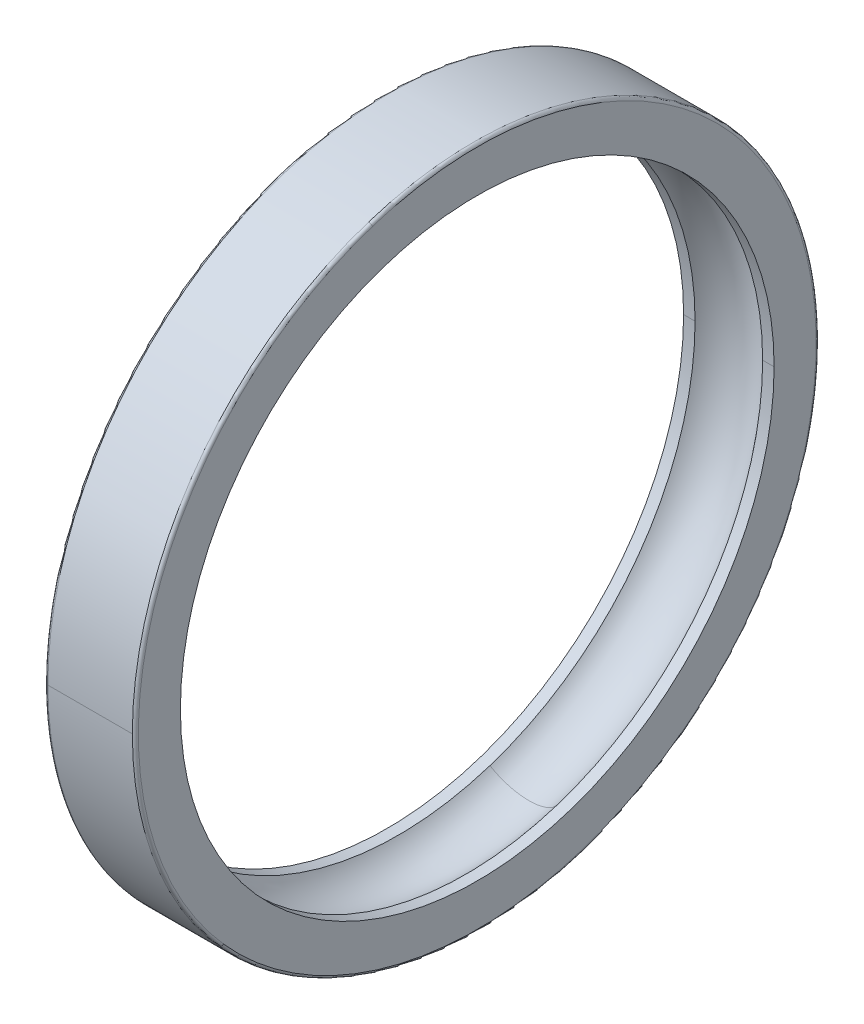
ISO-10303-21;
HEADER;
FILE_DESCRIPTION(('STEP AP214'),'2;1');
FILE_NAME('part.step','',(''),(''),'','','');
FILE_SCHEMA(('AUTOMOTIVE_DESIGN { 1 0 10303 214 1 1 1 1 }'));
ENDSEC;
DATA;
#1=APPLICATION_CONTEXT('core data for automotive mechanical design processes');
#2=APPLICATION_PROTOCOL_DEFINITION('international standard','automotive_design',2000,#1);
#3=PRODUCT_CONTEXT('',#1,'mechanical');
#4=PRODUCT('Part','Part','',(#3));
#5=PRODUCT_RELATED_PRODUCT_CATEGORY('part','',(#4));
#6=PRODUCT_DEFINITION_FORMATION('','',#4);
#7=PRODUCT_DEFINITION_CONTEXT('part definition',#1,'design');
#8=PRODUCT_DEFINITION('design','',#6,#7);
#9=PRODUCT_DEFINITION_SHAPE('','',#8);
#10=(LENGTH_UNIT() NAMED_UNIT(*) SI_UNIT(.MILLI.,.METRE.));
#11=(NAMED_UNIT(*) PLANE_ANGLE_UNIT() SI_UNIT($,.RADIAN.));
#12=(NAMED_UNIT(*) SI_UNIT($,.STERADIAN.) SOLID_ANGLE_UNIT());
#13=UNCERTAINTY_MEASURE_WITH_UNIT(LENGTH_MEASURE(1.E-05),#10,'distance_accuracy_value','');
#14=(GEOMETRIC_REPRESENTATION_CONTEXT(3) GLOBAL_UNCERTAINTY_ASSIGNED_CONTEXT((#13)) GLOBAL_UNIT_ASSIGNED_CONTEXT((#10,
#11,#12)) REPRESENTATION_CONTEXT('',''));
#15=CARTESIAN_POINT('',(0.,0.,0.));
#16=DIRECTION('',(0.,0.,1.));
#17=DIRECTION('',(1.,0.,0.));
#18=AXIS2_PLACEMENT_3D('',#15,#16,#17);
#19=CARTESIAN_POINT('',(0.,33.7,0.));
#20=DIRECTION('',(-1.,0.,0.));
#21=DIRECTION('',(0.,0.,1.));
#22=AXIS2_PLACEMENT_3D('',#19,#20,#21);
#23=PLANE('',#22);
#24=CARTESIAN_POINT('',(0.,0.,0.));
#25=DIRECTION('',(1.,0.,0.));
#26=DIRECTION('',(0.,0.,-1.));
#27=AXIS2_PLACEMENT_3D('',#24,#25,#26);
#28=CIRCLE('',#27,29.52);
#29=CARTESIAN_POINT('',(0.,0.,-29.52));
#30=VERTEX_POINT('',#29);
#31=CARTESIAN_POINT('',(0.,0.,29.52));
#32=VERTEX_POINT('',#31);
#33=EDGE_CURVE('E11',#30,#32,#28,.T.);
#34=ORIENTED_EDGE('',*,*,#33,.T.);
#35=CARTESIAN_POINT('',(0.,0.,0.));
#36=DIRECTION('',(1.,0.,0.));
#37=DIRECTION('',(0.,0.,-1.));
#38=AXIS2_PLACEMENT_3D('',#35,#36,#37);
#39=CIRCLE('',#38,29.52);
#40=EDGE_CURVE('E26',#32,#30,#39,.T.);
#41=ORIENTED_EDGE('',*,*,#40,.T.);
#42=EDGE_LOOP('',(#34,#41));
#43=FACE_BOUND('',#42,.T.);
#44=CARTESIAN_POINT('',(0.,32.0506045991467,10.4138727104358));
#45=CARTESIAN_POINT('',(0.,31.8802189577156,10.9383036459761));
#46=CARTESIAN_POINT('',(0.,31.6969404011006,11.4585443729204));
#47=CARTESIAN_POINT('',(0.,31.3050870541263,12.4894103733798));
#48=CARTESIAN_POINT('',(0.,31.096512263767,13.0000356468947));
#49=CARTESIAN_POINT('',(0.,30.6545560459279,14.0104357042572));
#50=CARTESIAN_POINT('',(0.,30.4211746184479,14.5102104881048));
#51=CARTESIAN_POINT('',(0.,29.9301708134022,15.4977068765759));
#52=CARTESIAN_POINT('',(0.,29.6725484358364,15.9854284811993));
#53=CARTESIAN_POINT('',(0.,29.1336824408701,16.9476431956956));
#54=CARTESIAN_POINT('',(0.,28.8524388234696,17.4221363055684));
#55=CARTESIAN_POINT('',(0.,28.2670081370938,18.3567510292747));
#56=CARTESIAN_POINT('',(0.,27.9628210681185,18.8168726431083));
#57=CARTESIAN_POINT('',(0.,27.3322362255011,19.7216358762329));
#58=CARTESIAN_POINT('',(0.,27.005838451859,20.1662774955239));
#59=CARTESIAN_POINT('',(0.,26.3316185385215,21.0390095657177));
#60=CARTESIAN_POINT('',(0.,25.9837963988261,21.4671000166206));
#61=CARTESIAN_POINT('',(0.,25.2675656826159,22.3056984408339));
#62=CARTESIAN_POINT('',(0.,24.8991571061012,22.7162064141445));
#63=CARTESIAN_POINT('',(0.,24.1426410460591,23.5186509339946));
#64=CARTESIAN_POINT('',(0.,23.7545335625317,23.9105874805343));
#65=CARTESIAN_POINT('',(0.,22.9595546730441,24.6749449372425));
#66=CARTESIAN_POINT('',(0.,22.5526832670839,25.0473658474111));
#67=CARTESIAN_POINT('',(0.,21.721156721677,25.7717948368191));
#68=CARTESIAN_POINT('',(0.,21.2965015822303,26.1238029160585));
#69=CARTESIAN_POINT('',(0.,20.4304306012523,26.8065582253038));
#70=CARTESIAN_POINT('',(0.,19.989014759721,27.1373054553097));
#71=CARTESIAN_POINT('',(0.,19.0904857840059,27.7767422670432));
#72=CARTESIAN_POINT('',(0.,18.6333726498222,28.0854318487709));
#73=CARTESIAN_POINT('',(0.,17.7045503143791,28.6800097037069));
#74=CARTESIAN_POINT('',(0.,17.2328411131199,28.9658979769153));
#75=CARTESIAN_POINT('',(0.,16.2759630323089,29.514184484922));
#76=CARTESIAN_POINT('',(0.,15.7907941527573,29.7765827197203));
#77=CARTESIAN_POINT('',(0.,14.8081655296881,30.2772570105757));
#78=CARTESIAN_POINT('',(0.,14.3107057861705,30.5155330666329));
#79=CARTESIAN_POINT('',(0.,13.304693859264,30.9673889721165));
#80=CARTESIAN_POINT('',(0.,12.7961416758751,31.1809688215429));
#81=CARTESIAN_POINT('',(0.,11.7691700159795,31.5829177812005));
#82=CARTESIAN_POINT('',(0.,11.2507505394728,31.7712868914316));
#83=CARTESIAN_POINT('',(0.,10.2052932112689,32.1223605750127));
#84=CARTESIAN_POINT('',(0.,9.67825535957162,32.2850651483627));
#85=CARTESIAN_POINT('',(0.,8.61683096133426,32.5844177886132));
#86=CARTESIAN_POINT('',(0.,8.08244441479417,32.7210658555137));
#87=CARTESIAN_POINT('',(0.,7.00761001086851,32.967976285703));
#88=CARTESIAN_POINT('',(0.,6.46716215348294,33.0782386489918));
#89=CARTESIAN_POINT('',(0.,5.38150711409243,33.2721120402669));
#90=CARTESIAN_POINT('',(0.,4.83629993208748,33.3557230682531));
#91=CARTESIAN_POINT('',(0.,3.74243969531415,33.4960923626329));
#92=CARTESIAN_POINT('',(0.,3.19378664054578,33.5528506290266));
#93=CARTESIAN_POINT('',(0.,2.09435641151086,33.6393776645862));
#94=CARTESIAN_POINT('',(0.,1.54357923724432,33.6691464337522));
#95=CARTESIAN_POINT('',(0.,0.441227639668275,33.701622759284));
#96=CARTESIAN_POINT('',(0.,-0.110346783641229,33.7043303156499));
#97=CARTESIAN_POINT('',(0.,-1.21296408820524,33.6826776928412));
#98=CARTESIAN_POINT('',(0.,-1.76400696945974,33.6583175136666));
#99=CARTESIAN_POINT('',(0.,-2.86423367934716,33.5825881055822));
#100=CARTESIAN_POINT('',(0.,-3.41341750798007,33.5312188766725));
#101=CARTESIAN_POINT('',(0.,-4.5086030806783,33.4015951220896));
#102=CARTESIAN_POINT('',(0.,-5.05460482474361,33.3233405964165));
#103=CARTESIAN_POINT('',(0.,-6.14211086228109,33.1401347703136));
#104=CARTESIAN_POINT('',(0.,-6.68361515575326,33.0351834698838));
#105=CARTESIAN_POINT('',(0.,-7.76082176083128,32.798836931143));
#106=CARTESIAN_POINT('',(0.,-8.29652407243714,32.6674416928319));
#107=CARTESIAN_POINT('',(0.,-9.36083615999192,32.3785238209664));
#108=CARTESIAN_POINT('',(0.,-9.88944593594084,32.221001187412));
#109=CARTESIAN_POINT('',(0.,-10.9382994849307,31.8802080108814));
#110=CARTESIAN_POINT('',(0.,-11.4585432579717,31.6969374679052));
#111=CARTESIAN_POINT('',(0.,-12.4894114883285,31.3050899873217));
#112=CARTESIAN_POINT('',(0.,-13.0000359456442,31.0965130497144));
#113=CARTESIAN_POINT('',(0.,-14.0104354055075,30.6545552599805));
#114=CARTESIAN_POINT('',(0.,-14.5102104080551,30.421174407854));
#115=CARTESIAN_POINT('',(0.,-15.4977069566256,29.9301710239962));
#116=CARTESIAN_POINT('',(0.,-15.9854285026486,29.6725484922649));
#117=CARTESIAN_POINT('',(0.,-16.9476431742463,29.1336823844416));
#118=CARTESIAN_POINT('',(0.,-17.422136299821,28.8524388083496));
#119=CARTESIAN_POINT('',(0.,-18.356751035022,28.2670081522137));
#120=CARTESIAN_POINT('',(0.,-18.8168726446483,27.9628210721699));
#121=CARTESIAN_POINT('',(0.,-19.7216358746929,27.3322362214497));
#122=CARTESIAN_POINT('',(0.,-20.1662774951112,27.0058384507734));
#123=CARTESIAN_POINT('',(0.,-21.0390095661303,26.331618539607));
#124=CARTESIAN_POINT('',(0.,-21.4671000167311,25.983796399117));
#125=CARTESIAN_POINT('',(0.,-22.3056984407234,25.2675656823251));
#126=CARTESIAN_POINT('',(0.,-22.7162064141148,24.8991571060233));
#127=CARTESIAN_POINT('',(0.,-23.5186509340242,24.142641046137));
#128=CARTESIAN_POINT('',(0.,-23.9105874805422,23.7545335625526));
#129=CARTESIAN_POINT('',(0.,-24.6749449372346,22.9595546730232));
#130=CARTESIAN_POINT('',(0.,-25.0473658474089,22.5526832670783));
#131=CARTESIAN_POINT('',(0.,-25.7717948368212,21.7211567216826));
#132=CARTESIAN_POINT('',(0.,-26.123802916059,21.2965015822319));
#133=CARTESIAN_POINT('',(0.,-26.8065582253032,20.4304306012509));
#134=CARTESIAN_POINT('',(0.,-27.1373054553095,19.9890147597206));
#135=CARTESIAN_POINT('',(0.,-27.7767422670433,19.0904857840063));
#136=CARTESIAN_POINT('',(0.,-28.0854318487709,18.6333726498223));
#137=CARTESIAN_POINT('',(0.,-28.6800097037069,17.7045503143791));
#138=CARTESIAN_POINT('',(0.,-28.9658979769153,17.2328411131199));
#139=CARTESIAN_POINT('',(0.,-29.514184484922,16.275963032309));
#140=CARTESIAN_POINT('',(0.,-29.7765827197203,15.7907941527573));
#141=CARTESIAN_POINT('',(0.,-30.2772570105757,14.8081655296881));
#142=CARTESIAN_POINT('',(0.,-30.5155330666328,14.3107057861705));
#143=CARTESIAN_POINT('',(0.,-30.9673889721165,13.304693859264));
#144=CARTESIAN_POINT('',(0.,-31.180968821543,12.7961416758751));
#145=CARTESIAN_POINT('',(0.,-31.5829177812004,11.7691700159795));
#146=CARTESIAN_POINT('',(0.,-31.7712868914311,11.250750539473));
#147=CARTESIAN_POINT('',(0.,-32.1223605750131,10.2052932112688));
#148=CARTESIAN_POINT('',(0.,-32.2850651483642,9.67825535957124));
#149=CARTESIAN_POINT('',(0.,-32.5844177886116,8.61683096133471));
#150=CARTESIAN_POINT('',(0.,-32.7210658555079,8.08244441479577));
#151=CARTESIAN_POINT('',(0.,-32.9679762857088,7.00761001086698));
#152=CARTESIAN_POINT('',(0.,-33.0782386490134,6.46716215347713));
#153=CARTESIAN_POINT('',(0.,-33.2721120402453,5.38150711409832));
#154=CARTESIAN_POINT('',(0.,-33.3557230681726,4.83629993210935));
#155=CARTESIAN_POINT('',(0.,-33.4960923627134,3.74243969529233));
#156=CARTESIAN_POINT('',(0.,-33.5528506293269,3.19378664046427));
#157=CARTESIAN_POINT('',(0.,-33.6393776642859,2.0943564115924));
#158=CARTESIAN_POINT('',(0.,-33.6691464326314,1.54357923754859));
#159=CARTESIAN_POINT('',(0.,-33.7016227604048,0.44122763936406));
#160=CARTESIAN_POINT('',(0.,-33.7043303198328,-0.110346784776663));
#161=CARTESIAN_POINT('',(0.,-33.6826776886584,-1.21296408706974));
#162=CARTESIAN_POINT('',(0.,-33.6583174980561,-1.76400696522209));
#163=CARTESIAN_POINT('',(0.,-33.5825881211927,-2.86423368358475));
#164=CARTESIAN_POINT('',(0.,-33.5312189349316,-3.41341752379507));
#165=CARTESIAN_POINT('',(0.,-33.4015950638304,-4.50860306486327));
#166=CARTESIAN_POINT('',(0.,-33.3233403789904,-5.05460476572116));
#167=CARTESIAN_POINT('',(0.,-33.1401349877397,-6.14211092130351));
#168=CARTESIAN_POINT('',(0.,-33.0351842813292,-6.68361537602797));
#169=CARTESIAN_POINT('',(0.,-32.7988361196976,-7.76082154055651));
#170=CARTESIAN_POINT('',(0.,-32.6674386644765,-8.29652325036059));
#171=CARTESIAN_POINT('',(0.,-32.3785268493217,-9.36083698206841));
#172=CARTESIAN_POINT('',(0.,-32.2210124893879,-9.88944900397215));
#173=CARTESIAN_POINT('',(0.,-32.0506045991467,-10.4138727104357));
#174=B_SPLINE_CURVE_WITH_KNOTS('',3,(#44,#45,#46,#47,#48,#49,#50,#51,#52,#53,#54,#55,#56,#57,
#58,#59,#60,#61,#62,#63,#64,#65,#66,#67,#68,#69,#70,#71,#72,#73,#74,#75,#76,#77,#78,#79,#80,#81,
#82,#83,#84,#85,#86,#87,#88,#89,#90,#91,#92,#93,#94,#95,#96,#97,#98,#99,#100,#101,#102,#103,
#104,#105,#106,#107,#108,#109,#110,#111,#112,#113,#114,#115,#116,#117,#118,#119,#120,#121,#122,
#123,#124,#125,#126,#127,#128,#129,#130,#131,#132,#133,#134,#135,#136,#137,#138,#139,#140,#141,
#142,#143,#144,#145,#146,#147,#148,#149,#150,#151,#152,#153,#154,#155,#156,#157,#158,#159,#160,
#161,#162,#163,#164,#165,#166,#167,#168,#169,#170,#171,#172,#173),.UNSPECIFIED.,.F.,.F.,(4,2,2,
2,2,2,2,2,2,2,2,2,2,2,2,2,2,2,2,2,2,2,2,2,2,2,2,2,2,2,2,2,2,2,2,2,2,2,2,2,2,2,2,2,2,2,2,2,2,2,2,
2,2,2,2,2,2,2,2,2,2,2,2,2,4),(0.,1.65407880244428,3.30815760488857,4.96223640733286,
6.61631520977715,8.27039401222144,9.92447281466573,11.57855161711,13.2326304195543,
14.8867092219986,16.5407880244429,18.1948668268872,19.8489456293314,21.5030244317757,
23.15710323422,24.8111820366643,26.4652608391086,28.1193396415529,29.7734184439972,
31.4274972464415,33.0815760488857,34.73565485133,36.3897336537743,38.0438124562186,
39.6978912586629,41.3519700611072,43.0060488635515,44.6601276659957,46.31420646844,
47.9682852708843,49.6223640733286,51.2764428757729,52.9305216782172,54.5846004806615,
56.2386792831057,57.89275808555,59.5468368879943,61.2009156904386,62.8549944928829,
64.5090732953272,66.1631520977715,67.8172309002157,69.47130970266,71.1253885051043,
72.7794673075486,74.4335461099929,76.0876249124372,77.7417037148815,79.3957825173257,
81.04986131977,82.7039401222143,84.3580189246586,86.0120977271029,87.6661765295472,
89.3202553319914,90.9743341344358,92.62841293688,94.2824917393243,95.9365705417686,
97.5906493442129,99.2447281466572,100.898806949101,102.552885751546,104.20696455399,
105.861043356434),.UNSPECIFIED.);
#175=CARTESIAN_POINT('',(0.,32.0506045991467,10.4138727104357));
#176=VERTEX_POINT('',#175);
#177=CARTESIAN_POINT('',(0.,-32.0506045991467,-10.4138727104357));
#178=VERTEX_POINT('',#177);
#179=EDGE_CURVE('E242',#176,#178,#174,.T.);
#180=ORIENTED_EDGE('',*,*,#179,.F.);
#181=CARTESIAN_POINT('',(0.,-32.0506045991467,-10.4138727104358));
#182=CARTESIAN_POINT('',(0.,-31.8802189577156,-10.9383036459761));
#183=CARTESIAN_POINT('',(0.,-31.6969404011006,-11.4585443729204));
#184=CARTESIAN_POINT('',(0.,-31.3050870541263,-12.4894103733797));
#185=CARTESIAN_POINT('',(0.,-31.096512263767,-13.0000356468947));
#186=CARTESIAN_POINT('',(0.,-30.6545560459279,-14.0104357042572));
#187=CARTESIAN_POINT('',(0.,-30.4211746184479,-14.5102104881048));
#188=CARTESIAN_POINT('',(0.,-29.9301708134022,-15.4977068765759));
#189=CARTESIAN_POINT('',(0.,-29.6725484358364,-15.9854284811993));
#190=CARTESIAN_POINT('',(0.,-29.1336824408701,-16.9476431956956));
#191=CARTESIAN_POINT('',(0.,-28.8524388234696,-17.4221363055683));
#192=CARTESIAN_POINT('',(0.,-28.2670081370938,-18.3567510292747));
#193=CARTESIAN_POINT('',(0.,-27.9628210681185,-18.8168726431083));
#194=CARTESIAN_POINT('',(0.,-27.3322362255011,-19.7216358762329));
#195=CARTESIAN_POINT('',(0.,-27.005838451859,-20.1662774955238));
#196=CARTESIAN_POINT('',(0.,-26.3316185385215,-21.0390095657177));
#197=CARTESIAN_POINT('',(0.,-25.9837963988261,-21.4671000166205));
#198=CARTESIAN_POINT('',(0.,-25.2675656826159,-22.3056984408339));
#199=CARTESIAN_POINT('',(0.,-24.8991571061012,-22.7162064141445));
#200=CARTESIAN_POINT('',(0.,-24.1426410460591,-23.5186509339946));
#201=CARTESIAN_POINT('',(0.,-23.7545335625317,-23.9105874805343));
#202=CARTESIAN_POINT('',(0.,-22.9595546730441,-24.6749449372425));
#203=CARTESIAN_POINT('',(0.,-22.5526832670839,-25.047365847411));
#204=CARTESIAN_POINT('',(0.,-21.721156721677,-25.771794836819));
#205=CARTESIAN_POINT('',(0.,-21.2965015822304,-26.1238029160585));
#206=CARTESIAN_POINT('',(0.,-20.4304306012524,-26.8065582253038));
#207=CARTESIAN_POINT('',(0.,-19.989014759721,-27.1373054553097));
#208=CARTESIAN_POINT('',(0.,-19.0904857840059,-27.7767422670432));
#209=CARTESIAN_POINT('',(0.,-18.6333726498222,-28.0854318487708));
#210=CARTESIAN_POINT('',(0.,-17.7045503143792,-28.6800097037069));
#211=CARTESIAN_POINT('',(0.,-17.2328411131199,-28.9658979769153));
#212=CARTESIAN_POINT('',(0.,-16.2759630323089,-29.514184484922));
#213=CARTESIAN_POINT('',(0.,-15.7907941527573,-29.7765827197203));
#214=CARTESIAN_POINT('',(0.,-14.8081655296881,-30.2772570105757));
#215=CARTESIAN_POINT('',(0.,-14.3107057861705,-30.5155330666329));
#216=CARTESIAN_POINT('',(0.,-13.3046938592641,-30.9673889721165));
#217=CARTESIAN_POINT('',(0.,-12.7961416758751,-31.1809688215429));
#218=CARTESIAN_POINT('',(0.,-11.7691700159795,-31.5829177812005));
#219=CARTESIAN_POINT('',(0.,-11.2507505394729,-31.7712868914316));
#220=CARTESIAN_POINT('',(0.,-10.2052932112689,-32.1223605750127));
#221=CARTESIAN_POINT('',(0.,-9.67825535957166,-32.2850651483627));
#222=CARTESIAN_POINT('',(0.,-8.61683096133429,-32.5844177886132));
#223=CARTESIAN_POINT('',(0.,-8.0824444147942,-32.7210658555137));
#224=CARTESIAN_POINT('',(0.,-7.00761001086855,-32.967976285703));
#225=CARTESIAN_POINT('',(0.,-6.46716215348299,-33.0782386489918));
#226=CARTESIAN_POINT('',(0.,-5.38150711409247,-33.2721120402669));
#227=CARTESIAN_POINT('',(0.,-4.83629993208753,-33.3557230682531));
#228=CARTESIAN_POINT('',(0.,-3.7424396953142,-33.4960923626329));
#229=CARTESIAN_POINT('',(0.,-3.19378664054582,-33.5528506290266));
#230=CARTESIAN_POINT('',(0.,-2.0943564115109,-33.6393776645862));
#231=CARTESIAN_POINT('',(0.,-1.54357923724436,-33.6691464337522));
#232=CARTESIAN_POINT('',(0.,-0.441227639668314,-33.701622759284));
#233=CARTESIAN_POINT('',(0.,0.110346783641185,-33.7043303156499));
#234=CARTESIAN_POINT('',(0.,1.21296408820519,-33.6826776928412));
#235=CARTESIAN_POINT('',(0.,1.76400696945969,-33.6583175136666));
#236=CARTESIAN_POINT('',(0.,2.86423367934711,-33.5825881055822));
#237=CARTESIAN_POINT('',(0.,3.41341750798001,-33.5312188766725));
#238=CARTESIAN_POINT('',(0.,4.50860308067824,-33.4015951220896));
#239=CARTESIAN_POINT('',(0.,5.05460482474355,-33.3233405964165));
#240=CARTESIAN_POINT('',(0.,6.14211086228103,-33.1401347703136));
#241=CARTESIAN_POINT('',(0.,6.6836151557532,-33.0351834698838));
#242=CARTESIAN_POINT('',(0.,7.76082176083122,-32.798836931143));
#243=CARTESIAN_POINT('',(0.,8.29652407243708,-32.6674416928319));
#244=CARTESIAN_POINT('',(0.,9.36083615999186,-32.3785238209664));
#245=CARTESIAN_POINT('',(0.,9.88944593594078,-32.221001187412));
#246=CARTESIAN_POINT('',(0.,10.9382994849307,-31.8802080108814));
#247=CARTESIAN_POINT('',(0.,11.4585432579716,-31.6969374679052));
#248=CARTESIAN_POINT('',(0.,12.4894114883284,-31.3050899873217));
#249=CARTESIAN_POINT('',(0.,13.0000359456442,-31.0965130497144));
#250=CARTESIAN_POINT('',(0.,14.0104354055075,-30.6545552599806));
#251=CARTESIAN_POINT('',(0.,14.510210408055,-30.421174407854));
#252=CARTESIAN_POINT('',(0.,15.4977069566255,-29.9301710239962));
#253=CARTESIAN_POINT('',(0.,15.9854285026485,-29.6725484922649));
#254=CARTESIAN_POINT('',(0.,16.9476431742462,-29.1336823844416));
#255=CARTESIAN_POINT('',(0.,17.4221362998209,-28.8524388083497));
#256=CARTESIAN_POINT('',(0.,18.3567510350219,-28.2670081522138));
#257=CARTESIAN_POINT('',(0.,18.8168726446482,-27.9628210721699));
#258=CARTESIAN_POINT('',(0.,19.7216358746928,-27.3322362214497));
#259=CARTESIAN_POINT('',(0.,20.1662774951111,-27.0058384507735));
#260=CARTESIAN_POINT('',(0.,21.0390095661303,-26.3316185396071));
#261=CARTESIAN_POINT('',(0.,21.467100016731,-25.983796399117));
#262=CARTESIAN_POINT('',(0.,22.3056984407233,-25.2675656823251));
#263=CARTESIAN_POINT('',(0.,22.7162064141148,-24.8991571060233));
#264=CARTESIAN_POINT('',(0.,23.5186509340242,-24.1426410461371));
#265=CARTESIAN_POINT('',(0.,23.9105874805422,-23.7545335625526));
#266=CARTESIAN_POINT('',(0.,24.6749449372345,-22.9595546730233));
#267=CARTESIAN_POINT('',(0.,25.0473658474089,-22.5526832670784));
#268=CARTESIAN_POINT('',(0.,25.7717948368211,-21.7211567216827));
#269=CARTESIAN_POINT('',(0.,26.123802916059,-21.2965015822319));
#270=CARTESIAN_POINT('',(0.,26.8065582253032,-20.4304306012509));
#271=CARTESIAN_POINT('',(0.,27.1373054553095,-19.9890147597207));
#272=CARTESIAN_POINT('',(0.,27.7767422670433,-19.0904857840064));
#273=CARTESIAN_POINT('',(0.,28.0854318487708,-18.6333726498224));
#274=CARTESIAN_POINT('',(0.,28.6800097037068,-17.7045503143791));
#275=CARTESIAN_POINT('',(0.,28.9658979769152,-17.2328411131199));
#276=CARTESIAN_POINT('',(0.,29.514184484922,-16.2759630323091));
#277=CARTESIAN_POINT('',(0.,29.7765827197203,-15.7907941527574));
#278=CARTESIAN_POINT('',(0.,30.2772570105757,-14.8081655296882));
#279=CARTESIAN_POINT('',(0.,30.5155330666328,-14.3107057861706));
#280=CARTESIAN_POINT('',(0.,30.9673889721165,-13.3046938592641));
#281=CARTESIAN_POINT('',(0.,31.180968821543,-12.7961416758752));
#282=CARTESIAN_POINT('',(0.,31.5829177812003,-11.7691700159796));
#283=CARTESIAN_POINT('',(0.,31.7712868914311,-11.2507505394731));
#284=CARTESIAN_POINT('',(0.,32.1223605750131,-10.2052932112689));
#285=CARTESIAN_POINT('',(0.,32.2850651483642,-9.67825535957133));
#286=CARTESIAN_POINT('',(0.,32.5844177886116,-8.6168309613348));
#287=CARTESIAN_POINT('',(0.,32.7210658555079,-8.08244441479586));
#288=CARTESIAN_POINT('',(0.,32.9679762857088,-7.00761001086707));
#289=CARTESIAN_POINT('',(0.,33.0782386490134,-6.46716215347722));
#290=CARTESIAN_POINT('',(0.,33.2721120402453,-5.38150711409842));
#291=CARTESIAN_POINT('',(0.,33.3557230681726,-4.83629993210946));
#292=CARTESIAN_POINT('',(0.,33.4960923627134,-3.74243969529245));
#293=CARTESIAN_POINT('',(0.,33.5528506293269,-3.19378664046439));
#294=CARTESIAN_POINT('',(0.,33.6393776642859,-2.09435641159253));
#295=CARTESIAN_POINT('',(0.,33.6691464326314,-1.54357923754872));
#296=CARTESIAN_POINT('',(0.,33.7016227604048,-0.441227639364183));
#297=CARTESIAN_POINT('',(0.,33.7043303198328,0.110346784776538));
#298=CARTESIAN_POINT('',(0.,33.6826776886584,1.21296408706961));
#299=CARTESIAN_POINT('',(0.,33.6583174980561,1.76400696522197));
#300=CARTESIAN_POINT('',(0.,33.5825881211927,2.86423368358463));
#301=CARTESIAN_POINT('',(0.,33.5312189349316,3.41341752379494));
#302=CARTESIAN_POINT('',(0.,33.4015950638304,4.50860306486315));
#303=CARTESIAN_POINT('',(0.,33.3233403789904,5.05460476572104));
#304=CARTESIAN_POINT('',(0.,33.1401349877398,6.14211092130339));
#305=CARTESIAN_POINT('',(0.,33.0351842813292,6.68361537602785));
#306=CARTESIAN_POINT('',(0.,32.7988361196976,7.76082154055639));
#307=CARTESIAN_POINT('',(0.,32.6674386644766,8.29652325036047));
#308=CARTESIAN_POINT('',(0.,32.3785268493218,9.36083698206829));
#309=CARTESIAN_POINT('',(0.,32.221012489388,9.88944900397203));
#310=CARTESIAN_POINT('',(0.,32.0506045991467,10.4138727104356));
#311=B_SPLINE_CURVE_WITH_KNOTS('',3,(#181,#182,#183,#184,#185,#186,#187,#188,#189,#190,#191,
#192,#193,#194,#195,#196,#197,#198,#199,#200,#201,#202,#203,#204,#205,#206,#207,#208,#209,#210,
#211,#212,#213,#214,#215,#216,#217,#218,#219,#220,#221,#222,#223,#224,#225,#226,#227,#228,#229,
#230,#231,#232,#233,#234,#235,#236,#237,#238,#239,#240,#241,#242,#243,#244,#245,#246,#247,#248,
#249,#250,#251,#252,#253,#254,#255,#256,#257,#258,#259,#260,#261,#262,#263,#264,#265,#266,#267,
#268,#269,#270,#271,#272,#273,#274,#275,#276,#277,#278,#279,#280,#281,#282,#283,#284,#285,#286,
#287,#288,#289,#290,#291,#292,#293,#294,#295,#296,#297,#298,#299,#300,#301,#302,#303,#304,#305,
#306,#307,#308,#309,#310),.UNSPECIFIED.,.F.,.F.,(4,2,2,2,2,2,2,2,2,2,2,2,2,2,2,2,2,2,2,2,2,2,2,
2,2,2,2,2,2,2,2,2,2,2,2,2,2,2,2,2,2,2,2,2,2,2,2,2,2,2,2,2,2,2,2,2,2,2,2,2,2,2,2,2,4),(0.,
1.65407880244428,3.30815760488857,4.96223640733285,6.61631520977714,8.27039401222143,
9.92447281466571,11.57855161711,13.2326304195543,14.8867092219986,16.5407880244429,
18.1948668268871,19.8489456293314,21.5030244317757,23.15710323422,24.8111820366643,
26.4652608391086,28.1193396415528,29.7734184439971,31.4274972464414,33.0815760488857,
34.73565485133,36.3897336537743,38.0438124562186,39.6978912586628,41.3519700611071,
43.0060488635514,44.6601276659957,46.31420646844,47.9682852708843,49.6223640733285,
51.2764428757728,52.9305216782171,54.5846004806614,56.2386792831057,57.89275808555,
59.5468368879943,61.2009156904385,62.8549944928828,64.5090732953271,66.1631520977714,
67.8172309002157,69.47130970266,71.1253885051042,72.7794673075485,74.4335461099928,
76.0876249124371,77.7417037148814,79.3957825173257,81.04986131977,82.7039401222142,
84.3580189246585,86.0120977271028,87.6661765295471,89.3202553319914,90.9743341344357,
92.6284129368799,94.2824917393242,95.9365705417685,97.5906493442128,99.2447281466571,
100.898806949101,102.552885751546,104.20696455399,105.861043356434),.UNSPECIFIED.);
#312=EDGE_CURVE('E344',#178,#176,#311,.T.);
#313=ORIENTED_EDGE('',*,*,#312,.F.);
#314=EDGE_LOOP('',(#180,#313));
#315=FACE_BOUND('',#314,.T.);
#316=ADVANCED_FACE('F17',(#43,#315),#23,.T.);
#317=CARTESIAN_POINT('',(0.299999999999937,0.,0.));
#318=DIRECTION('',(1.,0.,0.));
#319=DIRECTION('',(0.,-0.309016994374947,0.951056516295154));
#320=AXIS2_PLACEMENT_3D('',#317,#318,#319);
#321=TOROIDAL_SURFACE('',#320,33.7,0.299999999999932);
#322=CARTESIAN_POINT('',(0.299999999999937,-32.0506045991467,-10.4138727104357));
#323=DIRECTION('',(0.,0.309016994374953,-0.951056516295152));
#324=DIRECTION('',(2.09832151654203E-13,-0.951056516295152,-0.309016994374953));
#325=AXIS2_PLACEMENT_3D('',#322,#323,#324);
#326=CIRCLE('',#325,0.29999999999993);
#327=CARTESIAN_POINT('',(0.3,-32.3359215540352,-10.5065778087482));
#328=VERTEX_POINT('',#327);
#329=EDGE_CURVE('E307',#328,#178,#326,.T.);
#330=ORIENTED_EDGE('',*,*,#329,.T.);
#331=ORIENTED_EDGE('',*,*,#312,.T.);
#332=CARTESIAN_POINT('',(0.299999999999937,32.0506045991467,10.4138727104357));
#333=DIRECTION('',(0.,-0.309016994374953,0.951056516295152));
#334=DIRECTION('',(2.09832151654203E-13,0.951056516295152,0.309016994374953));
#335=AXIS2_PLACEMENT_3D('',#332,#333,#334);
#336=CIRCLE('',#335,0.29999999999993);
#337=CARTESIAN_POINT('',(0.3,32.3359215540352,10.5065778087482));
#338=VERTEX_POINT('',#337);
#339=EDGE_CURVE('E303',#338,#176,#336,.T.);
#340=ORIENTED_EDGE('',*,*,#339,.F.);
#341=CARTESIAN_POINT('',(0.3,0.,0.));
#342=DIRECTION('',(1.,0.,0.));
#343=DIRECTION('',(0.,0.,-1.));
#344=AXIS2_PLACEMENT_3D('',#341,#342,#343);
#345=CIRCLE('',#344,34.);
#346=CARTESIAN_POINT('',(0.3,0.,-34.));
#347=VERTEX_POINT('',#346);
#348=EDGE_CURVE('E298',#347,#338,#345,.T.);
#349=ORIENTED_EDGE('',*,*,#348,.F.);
#350=CARTESIAN_POINT('',(0.3,0.,0.));
#351=DIRECTION('',(1.,0.,0.));
#352=DIRECTION('',(0.,0.,-1.));
#353=AXIS2_PLACEMENT_3D('',#350,#351,#352);
#354=CIRCLE('',#353,34.);
#355=EDGE_CURVE('E293',#328,#347,#354,.T.);
#356=ORIENTED_EDGE('',*,*,#355,.F.);
#357=EDGE_LOOP('',(#330,#331,#340,#349,#356));
#358=FACE_BOUND('',#357,.T.);
#359=ADVANCED_FACE('F315',(#358),#321,.T.);
#360=CARTESIAN_POINT('',(9.,0.,0.));
#361=DIRECTION('',(1.,0.,0.));
#362=DIRECTION('',(0.,1.,0.));
#363=AXIS2_PLACEMENT_3D('',#360,#361,#362);
#364=CYLINDRICAL_SURFACE('',#363,34.);
#365=DIRECTION('',(1.,0.,0.));
#366=VECTOR('',#365,1.);
#367=CARTESIAN_POINT('',(0.300000000000001,0.,34.));
#368=LINE('',#367,#366);
#369=CARTESIAN_POINT('',(0.300000000000001,0.,34.));
#370=VERTEX_POINT('',#369);
#371=CARTESIAN_POINT('',(8.7,0.,34.));
#372=VERTEX_POINT('',#371);
#373=EDGE_CURVE('E288',#370,#372,#368,.T.);
#374=ORIENTED_EDGE('',*,*,#373,.F.);
#375=CARTESIAN_POINT('',(0.3,0.,0.));
#376=DIRECTION('',(1.,0.,0.));
#377=DIRECTION('',(0.,0.,-1.));
#378=AXIS2_PLACEMENT_3D('',#375,#376,#377);
#379=CIRCLE('',#378,34.);
#380=EDGE_CURVE('E283',#370,#328,#379,.T.);
#381=ORIENTED_EDGE('',*,*,#380,.T.);
#382=ORIENTED_EDGE('',*,*,#355,.T.);
#383=DIRECTION('',(1.,0.,0.));
#384=VECTOR('',#383,1.);
#385=CARTESIAN_POINT('',(0.300000000000001,0.,-34.));
#386=LINE('',#385,#384);
#387=CARTESIAN_POINT('',(8.7,0.,-34.));
#388=VERTEX_POINT('',#387);
#389=EDGE_CURVE('E279',#347,#388,#386,.T.);
#390=ORIENTED_EDGE('',*,*,#389,.T.);
#391=CARTESIAN_POINT('',(8.7,0.,0.));
#392=DIRECTION('',(1.,0.,0.));
#393=DIRECTION('',(0.,0.,-1.));
#394=AXIS2_PLACEMENT_3D('',#391,#392,#393);
#395=CIRCLE('',#394,34.);
#396=CARTESIAN_POINT('',(8.7,-32.3359215540351,-10.5065778087482));
#397=VERTEX_POINT('',#396);
#398=EDGE_CURVE('E274',#397,#388,#395,.T.);
#399=ORIENTED_EDGE('',*,*,#398,.F.);
#400=CARTESIAN_POINT('',(8.7,0.,0.));
#401=DIRECTION('',(1.,0.,0.));
#402=DIRECTION('',(0.,0.,-1.));
#403=AXIS2_PLACEMENT_3D('',#400,#401,#402);
#404=CIRCLE('',#403,34.);
#405=EDGE_CURVE('E269',#372,#397,#404,.T.);
#406=ORIENTED_EDGE('',*,*,#405,.F.);
#407=EDGE_LOOP('',(#374,#381,#382,#390,#399,#406));
#408=FACE_BOUND('',#407,.T.);
#409=ADVANCED_FACE('F324',(#408),#364,.T.);
#410=CARTESIAN_POINT('',(8.70000000000012,0.,0.));
#411=DIRECTION('',(1.,0.,0.));
#412=DIRECTION('',(0.,0.309016994374947,-0.951056516295154));
#413=AXIS2_PLACEMENT_3D('',#410,#411,#412);
#414=TOROIDAL_SURFACE('',#413,33.7,0.299999999999878);
#415=CARTESIAN_POINT('',(8.70000000000012,-32.0506045991467,-10.4138727104357));
#416=DIRECTION('',(0.,0.309016994374947,-0.951056516295154));
#417=DIRECTION('',(1.,0.,0.));
#418=AXIS2_PLACEMENT_3D('',#415,#416,#417);
#419=CIRCLE('',#418,0.299999999999878);
#420=CARTESIAN_POINT('',(9.,-32.0506045991467,-10.4138727104357));
#421=VERTEX_POINT('',#420);
#422=EDGE_CURVE('E265',#421,#397,#419,.T.);
#423=ORIENTED_EDGE('',*,*,#422,.F.);
#424=CARTESIAN_POINT('',(9.,0.,0.));
#425=DIRECTION('',(1.,0.,0.));
#426=DIRECTION('',(0.,0.,-1.));
#427=AXIS2_PLACEMENT_3D('',#424,#425,#426);
#428=CIRCLE('',#427,33.7);
#429=CARTESIAN_POINT('',(9.,32.0506045991467,10.4138727104357));
#430=VERTEX_POINT('',#429);
#431=EDGE_CURVE('E260',#430,#421,#428,.T.);
#432=ORIENTED_EDGE('',*,*,#431,.F.);
#433=CARTESIAN_POINT('',(8.70000000000012,32.0506045991467,10.4138727104357));
#434=DIRECTION('',(0.,-0.309016994374947,0.951056516295154));
#435=DIRECTION('',(1.,0.,0.));
#436=AXIS2_PLACEMENT_3D('',#433,#434,#435);
#437=CIRCLE('',#436,0.299999999999878);
#438=CARTESIAN_POINT('',(8.7,32.3359215540351,10.5065778087482));
#439=VERTEX_POINT('',#438);
#440=EDGE_CURVE('E256',#430,#439,#437,.T.);
#441=ORIENTED_EDGE('',*,*,#440,.T.);
#442=CARTESIAN_POINT('',(8.7,0.,0.));
#443=DIRECTION('',(1.,0.,0.));
#444=DIRECTION('',(0.,0.,-1.));
#445=AXIS2_PLACEMENT_3D('',#442,#443,#444);
#446=CIRCLE('',#445,34.);
#447=EDGE_CURVE('E251',#439,#372,#446,.T.);
#448=ORIENTED_EDGE('',*,*,#447,.T.);
#449=ORIENTED_EDGE('',*,*,#405,.T.);
#450=EDGE_LOOP('',(#423,#432,#441,#448,#449));
#451=FACE_BOUND('',#450,.T.);
#452=ADVANCED_FACE('F328',(#451),#414,.T.);
#453=CARTESIAN_POINT('',(9.,0.,0.));
#454=DIRECTION('',(1.,0.,0.));
#455=DIRECTION('',(0.,-1.,0.));
#456=AXIS2_PLACEMENT_3D('',#453,#454,#455);
#457=CYLINDRICAL_SURFACE('',#456,34.);
#458=ORIENTED_EDGE('',*,*,#373,.T.);
#459=ORIENTED_EDGE('',*,*,#447,.F.);
#460=CARTESIAN_POINT('',(8.7,0.,0.));
#461=DIRECTION('',(1.,0.,0.));
#462=DIRECTION('',(0.,0.,-1.));
#463=AXIS2_PLACEMENT_3D('',#460,#461,#462);
#464=CIRCLE('',#463,34.);
#465=EDGE_CURVE('E246',#388,#439,#464,.T.);
#466=ORIENTED_EDGE('',*,*,#465,.F.);
#467=ORIENTED_EDGE('',*,*,#389,.F.);
#468=ORIENTED_EDGE('',*,*,#348,.T.);
#469=CARTESIAN_POINT('',(0.3,0.,0.));
#470=DIRECTION('',(1.,0.,0.));
#471=DIRECTION('',(0.,0.,-1.));
#472=AXIS2_PLACEMENT_3D('',#469,#470,#471);
#473=CIRCLE('',#472,34.);
#474=EDGE_CURVE('E243',#338,#370,#473,.T.);
#475=ORIENTED_EDGE('',*,*,#474,.T.);
#476=EDGE_LOOP('',(#458,#459,#466,#467,#468,#475));
#477=FACE_BOUND('',#476,.T.);
#478=ADVANCED_FACE('F331',(#477),#457,.T.);
#479=CARTESIAN_POINT('',(0.299999999999937,0.,0.));
#480=DIRECTION('',(1.,0.,0.));
#481=DIRECTION('',(0.,0.309016994374947,-0.951056516295154));
#482=AXIS2_PLACEMENT_3D('',#479,#480,#481);
#483=TOROIDAL_SURFACE('',#482,33.7,0.299999999999932);
#484=ORIENTED_EDGE('',*,*,#329,.F.);
#485=ORIENTED_EDGE('',*,*,#380,.F.);
#486=ORIENTED_EDGE('',*,*,#474,.F.);
#487=ORIENTED_EDGE('',*,*,#339,.T.);
#488=ORIENTED_EDGE('',*,*,#179,.T.);
#489=EDGE_LOOP('',(#484,#485,#486,#487,#488));
#490=FACE_BOUND('',#489,.T.);
#491=ADVANCED_FACE('F213',(#490),#483,.T.);
#492=CARTESIAN_POINT('',(8.70000000000012,0.,0.));
#493=DIRECTION('',(1.,0.,0.));
#494=DIRECTION('',(0.,-0.309016994374947,0.951056516295154));
#495=AXIS2_PLACEMENT_3D('',#492,#493,#494);
#496=TOROIDAL_SURFACE('',#495,33.7,0.299999999999878);
#497=ORIENTED_EDGE('',*,*,#422,.T.);
#498=ORIENTED_EDGE('',*,*,#398,.T.);
#499=ORIENTED_EDGE('',*,*,#465,.T.);
#500=ORIENTED_EDGE('',*,*,#440,.F.);
#501=CARTESIAN_POINT('',(9.,-32.0506045991467,-10.4138727104357));
#502=CARTESIAN_POINT('',(9.,-30.4147308588356,-15.4483228016644));
#503=CARTESIAN_POINT('',(9.,-27.7907522979924,-20.1618751498115));
#504=CARTESIAN_POINT('',(9.,-24.2609635779448,-24.2945040145104));
#505=CARTESIAN_POINT('',(9.,-15.7712614788408,-30.9528316542851));
#506=CARTESIAN_POINT('',(9.,-5.39443282926451,-33.9075121375115));
#507=CARTESIAN_POINT('',(9.,0.023717965413849,-34.3339390922458));
#508=CARTESIAN_POINT('',(9.,10.7349890309453,-33.0388990122975));
#509=CARTESIAN_POINT('',(9.,20.1617948144383,-27.7906812797459));
#510=CARTESIAN_POINT('',(9.,24.2945234102463,-24.2609854946975));
#511=CARTESIAN_POINT('',(9.,30.9528365221936,-15.7712519250324));
#512=CARTESIAN_POINT('',(9.,33.9074830059584,-5.3944300201286));
#513=CARTESIAN_POINT('',(9.,34.3340437671618,0.0236947162096417));
#514=CARTESIAN_POINT('',(9.,33.6863304596099,5.37937457013183));
#515=CARTESIAN_POINT('',(9.,32.0506045991467,10.4138727104357));
#516=B_SPLINE_CURVE_WITH_KNOTS('',5,(#501,#502,#503,#504,#505,#506,#507,#508,#509,#510,#511,
#512,#513,#514,#515),.UNSPECIFIED.,.F.,.F.,(6,3,3,3,6),(0.,0.785398163397448,1.5707963267949,
2.35619449019234,3.14159265358979),.UNSPECIFIED.);
#517=EDGE_CURVE('E187',#421,#430,#516,.T.);
#518=ORIENTED_EDGE('',*,*,#517,.F.);
#519=EDGE_LOOP('',(#497,#498,#499,#500,#518));
#520=FACE_BOUND('',#519,.T.);
#521=ADVANCED_FACE('F207',(#520),#496,.T.);
#522=CARTESIAN_POINT('',(9.,29.52,0.));
#523=DIRECTION('',(1.,0.,0.));
#524=DIRECTION('',(0.,0.,-1.));
#525=AXIS2_PLACEMENT_3D('',#522,#523,#524);
#526=PLANE('',#525);
#527=ORIENTED_EDGE('',*,*,#431,.T.);
#528=ORIENTED_EDGE('',*,*,#517,.T.);
#529=EDGE_LOOP('',(#527,#528));
#530=FACE_BOUND('',#529,.T.);
#531=CARTESIAN_POINT('',(9.,0.,0.));
#532=DIRECTION('',(1.,0.,0.));
#533=DIRECTION('',(0.,0.,-1.));
#534=AXIS2_PLACEMENT_3D('',#531,#532,#533);
#535=CIRCLE('',#534,29.52);
#536=CARTESIAN_POINT('',(9.,0.,29.52));
#537=VERTEX_POINT('',#536);
#538=CARTESIAN_POINT('',(9.,0.,-29.52));
#539=VERTEX_POINT('',#538);
#540=EDGE_CURVE('E182',#537,#539,#535,.T.);
#541=ORIENTED_EDGE('',*,*,#540,.F.);
#542=CARTESIAN_POINT('',(9.,0.,0.));
#543=DIRECTION('',(1.,0.,0.));
#544=DIRECTION('',(0.,0.,-1.));
#545=AXIS2_PLACEMENT_3D('',#542,#543,#544);
#546=CIRCLE('',#545,29.52);
#547=EDGE_CURVE('E177',#539,#537,#546,.T.);
#548=ORIENTED_EDGE('',*,*,#547,.F.);
#549=EDGE_LOOP('',(#541,#548));
#550=FACE_BOUND('',#549,.T.);
#551=ADVANCED_FACE('F196',(#530,#550),#526,.T.);
#552=CARTESIAN_POINT('',(9.,0.,0.));
#553=DIRECTION('',(1.,0.,0.));
#554=DIRECTION('',(0.,-1.,0.));
#555=AXIS2_PLACEMENT_3D('',#552,#553,#554);
#556=CYLINDRICAL_SURFACE('',#555,29.52);
#557=DIRECTION('',(1.,0.,0.));
#558=VECTOR('',#557,1.);
#559=CARTESIAN_POINT('',(7.86,0.,29.52));
#560=LINE('',#559,#558);
#561=CARTESIAN_POINT('',(7.86,0.,29.52));
#562=VERTEX_POINT('',#561);
#563=EDGE_CURVE('E172',#562,#537,#560,.T.);
#564=ORIENTED_EDGE('',*,*,#563,.F.);
#565=CARTESIAN_POINT('',(7.86,0.,0.));
#566=DIRECTION('',(1.,0.,0.));
#567=DIRECTION('',(0.,0.,-1.));
#568=AXIS2_PLACEMENT_3D('',#565,#566,#567);
#569=CIRCLE('',#568,29.52);
#570=CARTESIAN_POINT('',(7.86,28.0751883610329,9.12218167394844));
#571=VERTEX_POINT('',#570);
#572=EDGE_CURVE('E167',#571,#562,#569,.T.);
#573=ORIENTED_EDGE('',*,*,#572,.F.);
#574=CARTESIAN_POINT('',(7.86,0.,0.));
#575=DIRECTION('',(1.,0.,0.));
#576=DIRECTION('',(0.,0.,-1.));
#577=AXIS2_PLACEMENT_3D('',#574,#575,#576);
#578=CIRCLE('',#577,29.52);
#579=CARTESIAN_POINT('',(7.86,0.,-29.52));
#580=VERTEX_POINT('',#579);
#581=EDGE_CURVE('E163',#580,#571,#578,.T.);
#582=ORIENTED_EDGE('',*,*,#581,.F.);
#583=DIRECTION('',(1.,0.,0.));
#584=VECTOR('',#583,1.);
#585=CARTESIAN_POINT('',(7.86,0.,-29.52));
#586=LINE('',#585,#584);
#587=EDGE_CURVE('E158',#580,#539,#586,.T.);
#588=ORIENTED_EDGE('',*,*,#587,.T.);
#589=ORIENTED_EDGE('',*,*,#547,.T.);
#590=EDGE_LOOP('',(#564,#573,#582,#588,#589));
#591=FACE_BOUND('',#590,.T.);
#592=ADVANCED_FACE('F206',(#591),#556,.F.);
#593=CARTESIAN_POINT('',(9.,0.,0.));
#594=DIRECTION('',(1.,0.,0.));
#595=DIRECTION('',(0.,1.,0.));
#596=AXIS2_PLACEMENT_3D('',#593,#594,#595);
#597=CYLINDRICAL_SURFACE('',#596,29.52);
#598=ORIENTED_EDGE('',*,*,#563,.T.);
#599=ORIENTED_EDGE('',*,*,#540,.T.);
#600=ORIENTED_EDGE('',*,*,#587,.F.);
#601=CARTESIAN_POINT('',(7.86,0.,0.));
#602=DIRECTION('',(1.,0.,0.));
#603=DIRECTION('',(0.,0.,-1.));
#604=AXIS2_PLACEMENT_3D('',#601,#602,#603);
#605=CIRCLE('',#604,29.52);
#606=CARTESIAN_POINT('',(7.86,-28.0751883610329,-9.12218167394844));
#607=VERTEX_POINT('',#606);
#608=EDGE_CURVE('E153',#607,#580,#605,.T.);
#609=ORIENTED_EDGE('',*,*,#608,.F.);
#610=CARTESIAN_POINT('',(7.86,0.,0.));
#611=DIRECTION('',(1.,0.,0.));
#612=DIRECTION('',(0.,0.,-1.));
#613=AXIS2_PLACEMENT_3D('',#610,#611,#612);
#614=CIRCLE('',#613,29.52);
#615=EDGE_CURVE('E148',#562,#607,#614,.T.);
#616=ORIENTED_EDGE('',*,*,#615,.F.);
#617=EDGE_LOOP('',(#598,#599,#600,#609,#616));
#618=FACE_BOUND('',#617,.T.);
#619=ADVANCED_FACE('F375',(#618),#597,.F.);
#620=CARTESIAN_POINT('',(4.5,0.,0.));
#621=DIRECTION('',(1.,0.,0.));
#622=DIRECTION('',(0.,0.309016994374947,-0.951056516295154));
#623=AXIS2_PLACEMENT_3D('',#620,#621,#622);
#624=TOROIDAL_SURFACE('',#623,27.,4.2);
#625=CARTESIAN_POINT('',(4.5,-25.6785259399691,-8.34345884812357));
#626=DIRECTION('',(0.,0.309016994374947,-0.951056516295154));
#627=DIRECTION('',(0.799999999999999,-0.570633909777094,-0.185410196624969));
#628=AXIS2_PLACEMENT_3D('',#625,#626,#627);
#629=CIRCLE('',#628,4.2);
#630=CARTESIAN_POINT('',(1.13999999999999,-28.0751883610329,-9.12218167394844));
#631=VERTEX_POINT('',#630);
#632=EDGE_CURVE('E144',#607,#631,#629,.T.);
#633=ORIENTED_EDGE('',*,*,#632,.T.);
#634=CARTESIAN_POINT('',(1.14,0.,0.));
#635=DIRECTION('',(1.,0.,0.));
#636=DIRECTION('',(0.,0.,-1.));
#637=AXIS2_PLACEMENT_3D('',#634,#635,#636);
#638=CIRCLE('',#637,29.52);
#639=CARTESIAN_POINT('',(1.14,0.,29.52));
#640=VERTEX_POINT('',#639);
#641=EDGE_CURVE('E120',#640,#631,#638,.T.);
#642=ORIENTED_EDGE('',*,*,#641,.F.);
#643=CARTESIAN_POINT('',(1.14,0.,0.));
#644=DIRECTION('',(1.,0.,0.));
#645=DIRECTION('',(0.,0.,-1.));
#646=AXIS2_PLACEMENT_3D('',#643,#644,#645);
#647=CIRCLE('',#646,29.52);
#648=CARTESIAN_POINT('',(1.14,28.0751883610329,9.12218167394844));
#649=VERTEX_POINT('',#648);
#650=EDGE_CURVE('E137',#649,#640,#647,.T.);
#651=ORIENTED_EDGE('',*,*,#650,.F.);
#652=CARTESIAN_POINT('',(4.5,25.6785259399691,8.34345884812358));
#653=DIRECTION('',(0.,-0.309016994374947,0.951056516295154));
#654=DIRECTION('',(0.8,0.570633909777092,0.185410196624968));
#655=AXIS2_PLACEMENT_3D('',#652,#653,#654);
#656=CIRCLE('',#655,4.2);
#657=EDGE_CURVE('E110',#571,#649,#656,.T.);
#658=ORIENTED_EDGE('',*,*,#657,.F.);
#659=ORIENTED_EDGE('',*,*,#572,.T.);
#660=ORIENTED_EDGE('',*,*,#615,.T.);
#661=EDGE_LOOP('',(#633,#642,#651,#658,#659,#660));
#662=FACE_BOUND('',#661,.T.);
#663=ADVANCED_FACE('F378',(#662),#624,.F.);
#664=CARTESIAN_POINT('',(4.5,0.,0.));
#665=DIRECTION('',(1.,0.,0.));
#666=DIRECTION('',(0.,-0.309016994374947,0.951056516295154));
#667=AXIS2_PLACEMENT_3D('',#664,#665,#666);
#668=TOROIDAL_SURFACE('',#667,27.,4.2);
#669=ORIENTED_EDGE('',*,*,#632,.F.);
#670=ORIENTED_EDGE('',*,*,#608,.T.);
#671=ORIENTED_EDGE('',*,*,#581,.T.);
#672=ORIENTED_EDGE('',*,*,#657,.T.);
#673=CARTESIAN_POINT('',(1.14,0.,0.));
#674=DIRECTION('',(1.,0.,0.));
#675=DIRECTION('',(0.,0.,-1.));
#676=AXIS2_PLACEMENT_3D('',#673,#674,#675);
#677=CIRCLE('',#676,29.52);
#678=CARTESIAN_POINT('',(1.14,0.,-29.52));
#679=VERTEX_POINT('',#678);
#680=EDGE_CURVE('E102',#679,#649,#677,.T.);
#681=ORIENTED_EDGE('',*,*,#680,.F.);
#682=CARTESIAN_POINT('',(1.14,0.,0.));
#683=DIRECTION('',(1.,0.,0.));
#684=DIRECTION('',(0.,0.,-1.));
#685=AXIS2_PLACEMENT_3D('',#682,#683,#684);
#686=CIRCLE('',#685,29.52);
#687=EDGE_CURVE('E106',#631,#679,#686,.T.);
#688=ORIENTED_EDGE('',*,*,#687,.F.);
#689=EDGE_LOOP('',(#669,#670,#671,#672,#681,#688));
#690=FACE_BOUND('',#689,.T.);
#691=ADVANCED_FACE('F105',(#690),#668,.F.);
#692=CARTESIAN_POINT('',(9.,0.,0.));
#693=DIRECTION('',(1.,0.,0.));
#694=DIRECTION('',(0.,1.,0.));
#695=AXIS2_PLACEMENT_3D('',#692,#693,#694);
#696=CYLINDRICAL_SURFACE('',#695,29.52);
#697=DIRECTION('',(1.,0.,0.));
#698=VECTOR('',#697,1.);
#699=CARTESIAN_POINT('',(0.,0.,29.52));
#700=LINE('',#699,#698);
#701=EDGE_CURVE('E121',#32,#640,#700,.T.);
#702=ORIENTED_EDGE('',*,*,#701,.T.);
#703=ORIENTED_EDGE('',*,*,#641,.T.);
#704=ORIENTED_EDGE('',*,*,#687,.T.);
#705=DIRECTION('',(1.,0.,0.));
#706=VECTOR('',#705,1.);
#707=CARTESIAN_POINT('',(0.,0.,-29.52));
#708=LINE('',#707,#706);
#709=EDGE_CURVE('E119',#30,#679,#708,.T.);
#710=ORIENTED_EDGE('',*,*,#709,.F.);
#711=ORIENTED_EDGE('',*,*,#40,.F.);
#712=EDGE_LOOP('',(#702,#703,#704,#710,#711));
#713=FACE_BOUND('',#712,.T.);
#714=ADVANCED_FACE('F118',(#713),#696,.F.);
#715=CARTESIAN_POINT('',(9.,0.,0.));
#716=DIRECTION('',(1.,0.,0.));
#717=DIRECTION('',(0.,-1.,0.));
#718=AXIS2_PLACEMENT_3D('',#715,#716,#717);
#719=CYLINDRICAL_SURFACE('',#718,29.52);
#720=ORIENTED_EDGE('',*,*,#701,.F.);
#721=ORIENTED_EDGE('',*,*,#33,.F.);
#722=ORIENTED_EDGE('',*,*,#709,.T.);
#723=ORIENTED_EDGE('',*,*,#680,.T.);
#724=ORIENTED_EDGE('',*,*,#650,.T.);
#725=EDGE_LOOP('',(#720,#721,#722,#723,#724));
#726=FACE_BOUND('',#725,.T.);
#727=ADVANCED_FACE('F124',(#726),#719,.F.);
#728=CLOSED_SHELL('',(#316,#359,#409,#452,#478,#491,#521,#551,#592,#619,#663,#691,#714,#727));
#729=MANIFOLD_SOLID_BREP('B1',#728);
#730=ADVANCED_BREP_SHAPE_REPRESENTATION('',(#18,#729),#14);
#731=SHAPE_DEFINITION_REPRESENTATION(#9,#730);
ENDSEC;
END-ISO-10303-21;
